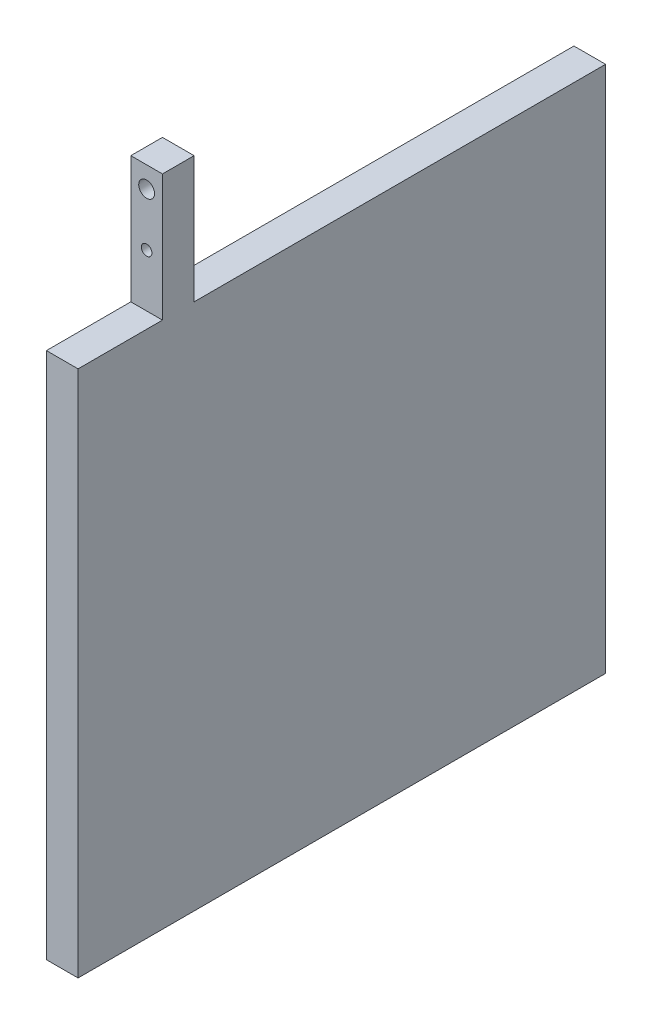
ISO-10303-21;
HEADER;
FILE_DESCRIPTION(('STEP AP214'),'2;1');
FILE_NAME('part.step','',(''),(''),'','','');
FILE_SCHEMA(('AUTOMOTIVE_DESIGN { 1 0 10303 214 1 1 1 1 }'));
ENDSEC;
DATA;
#1=APPLICATION_CONTEXT('core data for automotive mechanical design processes');
#2=APPLICATION_PROTOCOL_DEFINITION('international standard','automotive_design',2000,#1);
#3=PRODUCT_CONTEXT('',#1,'mechanical');
#4=PRODUCT('Part','Part','',(#3));
#5=PRODUCT_RELATED_PRODUCT_CATEGORY('part','',(#4));
#6=PRODUCT_DEFINITION_FORMATION('','',#4);
#7=PRODUCT_DEFINITION_CONTEXT('part definition',#1,'design');
#8=PRODUCT_DEFINITION('design','',#6,#7);
#9=PRODUCT_DEFINITION_SHAPE('','',#8);
#10=(LENGTH_UNIT() NAMED_UNIT(*) SI_UNIT(.MILLI.,.METRE.));
#11=(NAMED_UNIT(*) PLANE_ANGLE_UNIT() SI_UNIT($,.RADIAN.));
#12=(NAMED_UNIT(*) SI_UNIT($,.STERADIAN.) SOLID_ANGLE_UNIT());
#13=UNCERTAINTY_MEASURE_WITH_UNIT(LENGTH_MEASURE(1.E-05),#10,'distance_accuracy_value','');
#14=(GEOMETRIC_REPRESENTATION_CONTEXT(3) GLOBAL_UNCERTAINTY_ASSIGNED_CONTEXT((#13)) GLOBAL_UNIT_ASSIGNED_CONTEXT((#10,
#11,#12)) REPRESENTATION_CONTEXT('',''));
#15=CARTESIAN_POINT('',(0.,0.,0.));
#16=DIRECTION('',(0.,0.,1.));
#17=DIRECTION('',(1.,0.,0.));
#18=AXIS2_PLACEMENT_3D('',#15,#16,#17);
#19=CARTESIAN_POINT('',(3.,0.,-3.));
#20=DIRECTION('',(0.,-1.,0.));
#21=DIRECTION('',(0.,0.,-1.));
#22=AXIS2_PLACEMENT_3D('',#19,#20,#21);
#23=PLANE('',#22);
#24=DIRECTION('',(0.,0.,1.));
#25=VECTOR('',#24,1.);
#26=CARTESIAN_POINT('',(0.,0.,-3.));
#27=LINE('',#26,#25);
#28=CARTESIAN_POINT('',(0.,0.,-3.));
#29=VERTEX_POINT('',#28);
#30=CARTESIAN_POINT('',(0.,0.,0.));
#31=VERTEX_POINT('',#30);
#32=EDGE_CURVE('E131',#29,#31,#27,.T.);
#33=ORIENTED_EDGE('',*,*,#32,.T.);
#34=DIRECTION('',(-1.,0.,0.));
#35=VECTOR('',#34,1.);
#36=CARTESIAN_POINT('',(3.,0.,0.));
#37=LINE('',#36,#35);
#38=CARTESIAN_POINT('',(3.,0.,0.));
#39=VERTEX_POINT('',#38);
#40=EDGE_CURVE('E11',#39,#31,#37,.T.);
#41=ORIENTED_EDGE('',*,*,#40,.F.);
#42=DIRECTION('',(0.,0.,1.));
#43=VECTOR('',#42,1.);
#44=CARTESIAN_POINT('',(3.,0.,-3.));
#45=LINE('',#44,#43);
#46=CARTESIAN_POINT('',(3.,0.,-3.));
#47=VERTEX_POINT('',#46);
#48=EDGE_CURVE('E145',#47,#39,#45,.T.);
#49=ORIENTED_EDGE('',*,*,#48,.F.);
#50=DIRECTION('',(-1.,0.,0.));
#51=VECTOR('',#50,1.);
#52=CARTESIAN_POINT('',(3.,0.,-3.));
#53=LINE('',#52,#51);
#54=EDGE_CURVE('E127',#47,#29,#53,.T.);
#55=ORIENTED_EDGE('',*,*,#54,.T.);
#56=EDGE_LOOP('',(#33,#41,#49,#55));
#57=FACE_BOUND('',#56,.T.);
#58=ADVANCED_FACE('F33',(#57),#23,.F.);
#59=CARTESIAN_POINT('',(3.,0.,0.));
#60=DIRECTION('',(0.,0.,-1.));
#61=DIRECTION('',(0.,1.,0.));
#62=AXIS2_PLACEMENT_3D('',#59,#60,#61);
#63=PLANE('',#62);
#64=CARTESIAN_POINT('',(1.5,-2.,0.));
#65=DIRECTION('',(0.,0.,1.));
#66=DIRECTION('',(1.,0.,0.));
#67=AXIS2_PLACEMENT_3D('',#64,#65,#66);
#68=CIRCLE('',#67,0.75);
#69=CARTESIAN_POINT('',(2.25,-2.,0.));
#70=VERTEX_POINT('',#69);
#71=EDGE_CURVE('E158',#70,#70,#68,.T.);
#72=ORIENTED_EDGE('',*,*,#71,.F.);
#73=EDGE_LOOP('',(#72));
#74=FACE_BOUND('',#73,.T.);
#75=CARTESIAN_POINT('',(1.5,-7.,0.));
#76=DIRECTION('',(0.,0.,1.));
#77=DIRECTION('',(1.,0.,0.));
#78=AXIS2_PLACEMENT_3D('',#75,#76,#77);
#79=CIRCLE('',#78,0.5);
#80=CARTESIAN_POINT('',(2.,-7.,0.));
#81=VERTEX_POINT('',#80);
#82=EDGE_CURVE('E163',#81,#81,#79,.T.);
#83=ORIENTED_EDGE('',*,*,#82,.F.);
#84=EDGE_LOOP('',(#83));
#85=FACE_BOUND('',#84,.T.);
#86=DIRECTION('',(0.,-1.,0.));
#87=VECTOR('',#86,1.);
#88=CARTESIAN_POINT('',(0.,0.,0.));
#89=LINE('',#88,#87);
#90=CARTESIAN_POINT('',(0.,-12.,0.));
#91=VERTEX_POINT('',#90);
#92=EDGE_CURVE('E134',#31,#91,#89,.T.);
#93=ORIENTED_EDGE('',*,*,#92,.T.);
#94=DIRECTION('',(-1.,0.,0.));
#95=VECTOR('',#94,1.);
#96=CARTESIAN_POINT('',(3.,-12.,0.));
#97=LINE('',#96,#95);
#98=CARTESIAN_POINT('',(3.,-12.,0.));
#99=VERTEX_POINT('',#98);
#100=EDGE_CURVE('E42',#99,#91,#97,.T.);
#101=ORIENTED_EDGE('',*,*,#100,.F.);
#102=DIRECTION('',(0.,-1.,0.));
#103=VECTOR('',#102,1.);
#104=CARTESIAN_POINT('',(3.,0.,0.));
#105=LINE('',#104,#103);
#106=EDGE_CURVE('E94',#39,#99,#105,.T.);
#107=ORIENTED_EDGE('',*,*,#106,.F.);
#108=ORIENTED_EDGE('',*,*,#40,.T.);
#109=EDGE_LOOP('',(#93,#101,#107,#108));
#110=FACE_BOUND('',#109,.T.);
#111=ADVANCED_FACE('F206',(#74,#85,#110),#63,.F.);
#112=CARTESIAN_POINT('',(3.,-12.,0.));
#113=DIRECTION('',(0.,-1.,0.));
#114=DIRECTION('',(0.,0.,-1.));
#115=AXIS2_PLACEMENT_3D('',#112,#113,#114);
#116=PLANE('',#115);
#117=DIRECTION('',(0.,0.,1.));
#118=VECTOR('',#117,1.);
#119=CARTESIAN_POINT('',(0.,-12.,0.));
#120=LINE('',#119,#118);
#121=CARTESIAN_POINT('',(0.,-12.,8.));
#122=VERTEX_POINT('',#121);
#123=EDGE_CURVE('E136',#91,#122,#120,.T.);
#124=ORIENTED_EDGE('',*,*,#123,.T.);
#125=DIRECTION('',(-1.,0.,0.));
#126=VECTOR('',#125,1.);
#127=CARTESIAN_POINT('',(3.,-12.,8.));
#128=LINE('',#127,#126);
#129=CARTESIAN_POINT('',(3.,-12.,8.));
#130=VERTEX_POINT('',#129);
#131=EDGE_CURVE('E152',#130,#122,#128,.T.);
#132=ORIENTED_EDGE('',*,*,#131,.F.);
#133=DIRECTION('',(0.,0.,1.));
#134=VECTOR('',#133,1.);
#135=CARTESIAN_POINT('',(3.,-12.,0.));
#136=LINE('',#135,#134);
#137=EDGE_CURVE('E172',#99,#130,#136,.T.);
#138=ORIENTED_EDGE('',*,*,#137,.F.);
#139=ORIENTED_EDGE('',*,*,#100,.T.);
#140=EDGE_LOOP('',(#124,#132,#138,#139));
#141=FACE_BOUND('',#140,.T.);
#142=ADVANCED_FACE('F210',(#141),#116,.F.);
#143=CARTESIAN_POINT('',(3.,-12.,8.));
#144=DIRECTION('',(0.,0.,-1.));
#145=DIRECTION('',(0.,1.,0.));
#146=AXIS2_PLACEMENT_3D('',#143,#144,#145);
#147=PLANE('',#146);
#148=DIRECTION('',(0.,-1.,0.));
#149=VECTOR('',#148,1.);
#150=CARTESIAN_POINT('',(0.,-12.,8.));
#151=LINE('',#150,#149);
#152=CARTESIAN_POINT('',(0.,-62.,7.99999999999999));
#153=VERTEX_POINT('',#152);
#154=EDGE_CURVE('E138',#122,#153,#151,.T.);
#155=ORIENTED_EDGE('',*,*,#154,.T.);
#156=DIRECTION('',(-1.,0.,0.));
#157=VECTOR('',#156,1.);
#158=CARTESIAN_POINT('',(3.,-62.,7.99999999999999));
#159=LINE('',#158,#157);
#160=CARTESIAN_POINT('',(3.,-62.,7.99999999999999));
#161=VERTEX_POINT('',#160);
#162=EDGE_CURVE('E149',#161,#153,#159,.T.);
#163=ORIENTED_EDGE('',*,*,#162,.F.);
#164=DIRECTION('',(0.,-1.,0.));
#165=VECTOR('',#164,1.);
#166=CARTESIAN_POINT('',(3.,-12.,8.));
#167=LINE('',#166,#165);
#168=EDGE_CURVE('E174',#130,#161,#167,.T.);
#169=ORIENTED_EDGE('',*,*,#168,.F.);
#170=ORIENTED_EDGE('',*,*,#131,.T.);
#171=EDGE_LOOP('',(#155,#163,#169,#170));
#172=FACE_BOUND('',#171,.T.);
#173=ADVANCED_FACE('F180',(#172),#147,.F.);
#174=CARTESIAN_POINT('',(3.,-62.,7.99999999999999));
#175=DIRECTION('',(0.,1.,0.));
#176=DIRECTION('',(0.,0.,1.));
#177=AXIS2_PLACEMENT_3D('',#174,#175,#176);
#178=PLANE('',#177);
#179=DIRECTION('',(0.,0.,-1.));
#180=VECTOR('',#179,1.);
#181=CARTESIAN_POINT('',(0.,-62.,7.99999999999999));
#182=LINE('',#181,#180);
#183=CARTESIAN_POINT('',(0.,-62.,-42.));
#184=VERTEX_POINT('',#183);
#185=EDGE_CURVE('E140',#153,#184,#182,.T.);
#186=ORIENTED_EDGE('',*,*,#185,.T.);
#187=DIRECTION('',(-1.,0.,0.));
#188=VECTOR('',#187,1.);
#189=CARTESIAN_POINT('',(3.,-62.,-42.));
#190=LINE('',#189,#188);
#191=CARTESIAN_POINT('',(3.,-62.,-42.));
#192=VERTEX_POINT('',#191);
#193=EDGE_CURVE('E122',#192,#184,#190,.T.);
#194=ORIENTED_EDGE('',*,*,#193,.F.);
#195=DIRECTION('',(0.,0.,-1.));
#196=VECTOR('',#195,1.);
#197=CARTESIAN_POINT('',(3.,-62.,7.99999999999999));
#198=LINE('',#197,#196);
#199=EDGE_CURVE('E113',#161,#192,#198,.T.);
#200=ORIENTED_EDGE('',*,*,#199,.F.);
#201=ORIENTED_EDGE('',*,*,#162,.T.);
#202=EDGE_LOOP('',(#186,#194,#200,#201));
#203=FACE_BOUND('',#202,.T.);
#204=ADVANCED_FACE('F184',(#203),#178,.F.);
#205=CARTESIAN_POINT('',(3.,-62.,-42.));
#206=DIRECTION('',(0.,0.,1.));
#207=DIRECTION('',(1.,0.,0.));
#208=AXIS2_PLACEMENT_3D('',#205,#206,#207);
#209=PLANE('',#208);
#210=DIRECTION('',(0.,1.,0.));
#211=VECTOR('',#210,1.);
#212=CARTESIAN_POINT('',(0.,-62.,-42.));
#213=LINE('',#212,#211);
#214=CARTESIAN_POINT('',(0.,-12.,-42.));
#215=VERTEX_POINT('',#214);
#216=EDGE_CURVE('E121',#184,#215,#213,.T.);
#217=ORIENTED_EDGE('',*,*,#216,.T.);
#218=DIRECTION('',(-1.,0.,0.));
#219=VECTOR('',#218,1.);
#220=CARTESIAN_POINT('',(3.,-12.,-42.));
#221=LINE('',#220,#219);
#222=CARTESIAN_POINT('',(3.,-12.,-42.));
#223=VERTEX_POINT('',#222);
#224=EDGE_CURVE('E118',#223,#215,#221,.T.);
#225=ORIENTED_EDGE('',*,*,#224,.F.);
#226=DIRECTION('',(0.,1.,0.));
#227=VECTOR('',#226,1.);
#228=CARTESIAN_POINT('',(3.,-62.,-42.));
#229=LINE('',#228,#227);
#230=EDGE_CURVE('E107',#192,#223,#229,.T.);
#231=ORIENTED_EDGE('',*,*,#230,.F.);
#232=ORIENTED_EDGE('',*,*,#193,.T.);
#233=EDGE_LOOP('',(#217,#225,#231,#232));
#234=FACE_BOUND('',#233,.T.);
#235=ADVANCED_FACE('F119',(#234),#209,.F.);
#236=CARTESIAN_POINT('',(3.,-12.,-42.));
#237=DIRECTION('',(0.,-1.,0.));
#238=DIRECTION('',(0.,0.,-1.));
#239=AXIS2_PLACEMENT_3D('',#236,#237,#238);
#240=PLANE('',#239);
#241=DIRECTION('',(0.,0.,1.));
#242=VECTOR('',#241,1.);
#243=CARTESIAN_POINT('',(0.,-12.,-42.));
#244=LINE('',#243,#242);
#245=CARTESIAN_POINT('',(0.,-12.,-3.));
#246=VERTEX_POINT('',#245);
#247=EDGE_CURVE('E80',#215,#246,#244,.T.);
#248=ORIENTED_EDGE('',*,*,#247,.T.);
#249=DIRECTION('',(-1.,0.,0.));
#250=VECTOR('',#249,1.);
#251=CARTESIAN_POINT('',(3.,-12.,-3.));
#252=LINE('',#251,#250);
#253=CARTESIAN_POINT('',(3.,-12.,-3.));
#254=VERTEX_POINT('',#253);
#255=EDGE_CURVE('E123',#254,#246,#252,.T.);
#256=ORIENTED_EDGE('',*,*,#255,.F.);
#257=DIRECTION('',(0.,0.,1.));
#258=VECTOR('',#257,1.);
#259=CARTESIAN_POINT('',(3.,-12.,-42.));
#260=LINE('',#259,#258);
#261=EDGE_CURVE('E111',#223,#254,#260,.T.);
#262=ORIENTED_EDGE('',*,*,#261,.F.);
#263=ORIENTED_EDGE('',*,*,#224,.T.);
#264=EDGE_LOOP('',(#248,#256,#262,#263));
#265=FACE_BOUND('',#264,.T.);
#266=ADVANCED_FACE('F125',(#265),#240,.F.);
#267=CARTESIAN_POINT('',(3.,-12.,-3.));
#268=DIRECTION('',(0.,0.,1.));
#269=DIRECTION('',(1.,0.,0.));
#270=AXIS2_PLACEMENT_3D('',#267,#268,#269);
#271=PLANE('',#270);
#272=CARTESIAN_POINT('',(1.5,-2.,-3.));
#273=DIRECTION('',(0.,0.,1.));
#274=DIRECTION('',(1.,0.,0.));
#275=AXIS2_PLACEMENT_3D('',#272,#273,#274);
#276=CIRCLE('',#275,0.75);
#277=CARTESIAN_POINT('',(2.25,-2.,-3.));
#278=VERTEX_POINT('',#277);
#279=EDGE_CURVE('E36',#278,#278,#276,.T.);
#280=ORIENTED_EDGE('',*,*,#279,.T.);
#281=EDGE_LOOP('',(#280));
#282=FACE_BOUND('',#281,.T.);
#283=CARTESIAN_POINT('',(1.5,-7.,-3.));
#284=DIRECTION('',(0.,0.,1.));
#285=DIRECTION('',(1.,0.,0.));
#286=AXIS2_PLACEMENT_3D('',#283,#284,#285);
#287=CIRCLE('',#286,0.5);
#288=CARTESIAN_POINT('',(2.,-7.,-3.));
#289=VERTEX_POINT('',#288);
#290=EDGE_CURVE('E156',#289,#289,#287,.T.);
#291=ORIENTED_EDGE('',*,*,#290,.T.);
#292=EDGE_LOOP('',(#291));
#293=FACE_BOUND('',#292,.T.);
#294=DIRECTION('',(0.,1.,0.));
#295=VECTOR('',#294,1.);
#296=CARTESIAN_POINT('',(0.,-12.,-3.));
#297=LINE('',#296,#295);
#298=EDGE_CURVE('E86',#246,#29,#297,.T.);
#299=ORIENTED_EDGE('',*,*,#298,.T.);
#300=ORIENTED_EDGE('',*,*,#54,.F.);
#301=DIRECTION('',(0.,1.,0.));
#302=VECTOR('',#301,1.);
#303=CARTESIAN_POINT('',(3.,-12.,-3.));
#304=LINE('',#303,#302);
#305=EDGE_CURVE('E51',#254,#47,#304,.T.);
#306=ORIENTED_EDGE('',*,*,#305,.F.);
#307=ORIENTED_EDGE('',*,*,#255,.T.);
#308=EDGE_LOOP('',(#299,#300,#306,#307));
#309=FACE_BOUND('',#308,.T.);
#310=ADVANCED_FACE('F192',(#282,#293,#309),#271,.F.);
#311=CARTESIAN_POINT('',(3.,0.,0.));
#312=DIRECTION('',(1.,0.,0.));
#313=DIRECTION('',(0.,0.,-1.));
#314=AXIS2_PLACEMENT_3D('',#311,#312,#313);
#315=PLANE('',#314);
#316=ORIENTED_EDGE('',*,*,#48,.T.);
#317=ORIENTED_EDGE('',*,*,#106,.T.);
#318=ORIENTED_EDGE('',*,*,#137,.T.);
#319=ORIENTED_EDGE('',*,*,#168,.T.);
#320=ORIENTED_EDGE('',*,*,#199,.T.);
#321=ORIENTED_EDGE('',*,*,#230,.T.);
#322=ORIENTED_EDGE('',*,*,#261,.T.);
#323=ORIENTED_EDGE('',*,*,#305,.T.);
#324=EDGE_LOOP('',(#316,#317,#318,#319,#320,#321,#322,#323));
#325=FACE_BOUND('',#324,.T.);
#326=ADVANCED_FACE('F109',(#325),#315,.T.);
#327=CARTESIAN_POINT('',(0.,0.,0.));
#328=DIRECTION('',(1.,0.,0.));
#329=DIRECTION('',(0.,0.,-1.));
#330=AXIS2_PLACEMENT_3D('',#327,#328,#329);
#331=PLANE('',#330);
#332=ORIENTED_EDGE('',*,*,#32,.F.);
#333=ORIENTED_EDGE('',*,*,#298,.F.);
#334=ORIENTED_EDGE('',*,*,#247,.F.);
#335=ORIENTED_EDGE('',*,*,#216,.F.);
#336=ORIENTED_EDGE('',*,*,#185,.F.);
#337=ORIENTED_EDGE('',*,*,#154,.F.);
#338=ORIENTED_EDGE('',*,*,#123,.F.);
#339=ORIENTED_EDGE('',*,*,#92,.F.);
#340=EDGE_LOOP('',(#332,#333,#334,#335,#336,#337,#338,#339));
#341=FACE_BOUND('',#340,.T.);
#342=ADVANCED_FACE('F187',(#341),#331,.F.);
#343=CARTESIAN_POINT('',(1.5,-7.,-10.));
#344=DIRECTION('',(0.,0.,1.));
#345=DIRECTION('',(1.,0.,0.));
#346=AXIS2_PLACEMENT_3D('',#343,#344,#345);
#347=CYLINDRICAL_SURFACE('',#346,0.5);
#348=ORIENTED_EDGE('',*,*,#82,.T.);
#349=EDGE_LOOP('',(#348));
#350=FACE_BOUND('',#349,.T.);
#351=ORIENTED_EDGE('',*,*,#290,.F.);
#352=EDGE_LOOP('',(#351));
#353=FACE_BOUND('',#352,.T.);
#354=ADVANCED_FACE('F245',(#350,#353),#347,.F.);
#355=CARTESIAN_POINT('',(1.5,-2.,-10.));
#356=DIRECTION('',(0.,0.,1.));
#357=DIRECTION('',(1.,0.,0.));
#358=AXIS2_PLACEMENT_3D('',#355,#356,#357);
#359=CYLINDRICAL_SURFACE('',#358,0.75);
#360=ORIENTED_EDGE('',*,*,#71,.T.);
#361=EDGE_LOOP('',(#360));
#362=FACE_BOUND('',#361,.T.);
#363=ORIENTED_EDGE('',*,*,#279,.F.);
#364=EDGE_LOOP('',(#363));
#365=FACE_BOUND('',#364,.T.);
#366=ADVANCED_FACE('F250',(#362,#365),#359,.F.);
#367=CLOSED_SHELL('',(#58,#111,#142,#173,#204,#235,#266,#310,#326,#342,#354,#366));
#368=MANIFOLD_SOLID_BREP('B2',#367);
#369=ADVANCED_BREP_SHAPE_REPRESENTATION('',(#18,#368),#14);
#370=SHAPE_DEFINITION_REPRESENTATION(#9,#369);
ENDSEC;
END-ISO-10303-21;
